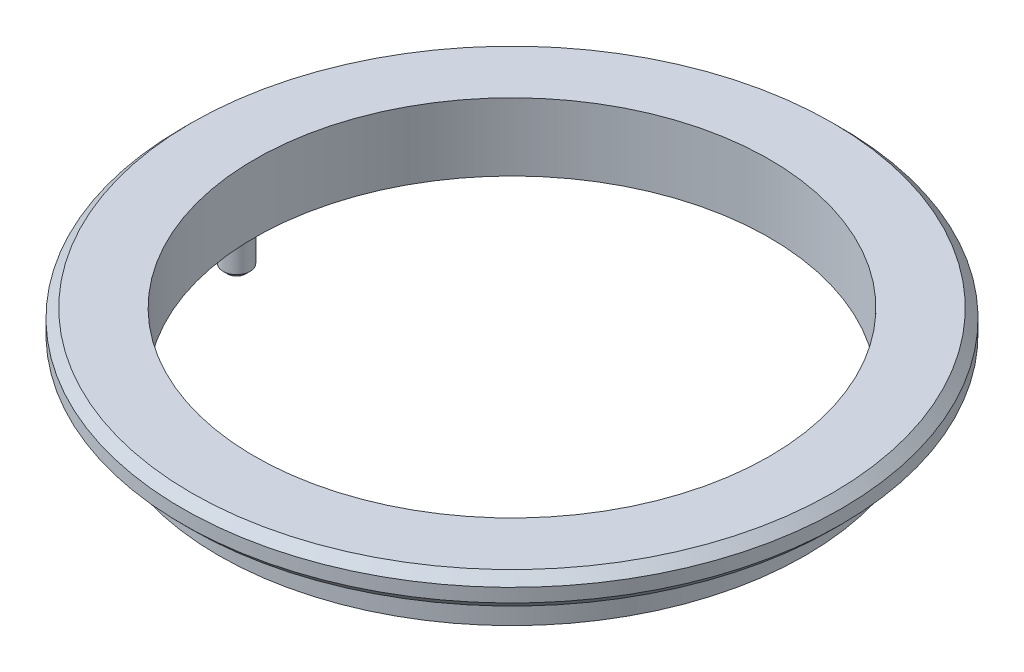
ISO-10303-21;
HEADER;
FILE_DESCRIPTION(('STEP AP214'),'2;1');
FILE_NAME('part.step','',(''),(''),'','','');
FILE_SCHEMA(('AUTOMOTIVE_DESIGN { 1 0 10303 214 1 1 1 1 }'));
ENDSEC;
DATA;
#1=APPLICATION_CONTEXT('core data for automotive mechanical design processes');
#2=APPLICATION_PROTOCOL_DEFINITION('international standard','automotive_design',2000,#1);
#3=PRODUCT_CONTEXT('',#1,'mechanical');
#4=PRODUCT('Part','Part','',(#3));
#5=PRODUCT_RELATED_PRODUCT_CATEGORY('part','',(#4));
#6=PRODUCT_DEFINITION_FORMATION('','',#4);
#7=PRODUCT_DEFINITION_CONTEXT('part definition',#1,'design');
#8=PRODUCT_DEFINITION('design','',#6,#7);
#9=PRODUCT_DEFINITION_SHAPE('','',#8);
#10=(LENGTH_UNIT() NAMED_UNIT(*) SI_UNIT(.MILLI.,.METRE.));
#11=(NAMED_UNIT(*) PLANE_ANGLE_UNIT() SI_UNIT($,.RADIAN.));
#12=(NAMED_UNIT(*) SI_UNIT($,.STERADIAN.) SOLID_ANGLE_UNIT());
#13=UNCERTAINTY_MEASURE_WITH_UNIT(LENGTH_MEASURE(1.E-05),#10,'distance_accuracy_value','');
#14=(GEOMETRIC_REPRESENTATION_CONTEXT(3) GLOBAL_UNCERTAINTY_ASSIGNED_CONTEXT((#13)) GLOBAL_UNIT_ASSIGNED_CONTEXT((#10,
#11,#12)) REPRESENTATION_CONTEXT('',''));
#15=CARTESIAN_POINT('',(0.,0.,0.));
#16=DIRECTION('',(0.,0.,1.));
#17=DIRECTION('',(1.,0.,0.));
#18=AXIS2_PLACEMENT_3D('',#15,#16,#17);
#19=CARTESIAN_POINT('',(-190.121307373047,-33.,-182.5));
#20=DIRECTION('',(0.,1.,0.));
#21=DIRECTION('',(-1.,0.,0.));
#22=AXIS2_PLACEMENT_3D('',#19,#20,#21);
#23=CYLINDRICAL_SURFACE('',#22,32.5);
#24=CARTESIAN_POINT('',(-190.121307373047,-29.,-182.5));
#25=DIRECTION('',(0.,-1.,0.));
#26=DIRECTION('',(-1.,0.,0.));
#27=AXIS2_PLACEMENT_3D('',#24,#25,#26);
#28=CIRCLE('',#27,32.5);
#29=CARTESIAN_POINT('',(-157.621307373047,-29.,-182.5));
#30=VERTEX_POINT('',#29);
#31=EDGE_CURVE('E149',#30,#30,#28,.T.);
#32=ORIENTED_EDGE('',*,*,#31,.T.);
#33=DIRECTION('',(0.,-1.,0.));
#34=VECTOR('',#33,1.);
#35=CARTESIAN_POINT('',(-157.621307373047,-33.,-182.5));
#36=LINE('',#35,#34);
#37=CARTESIAN_POINT('',(-157.621307373047,-32.9999,-182.5));
#38=VERTEX_POINT('',#37);
#39=EDGE_CURVE('E11',#30,#38,#36,.T.);
#40=ORIENTED_EDGE('',*,*,#39,.T.);
#41=CARTESIAN_POINT('',(-190.121307373047,-32.9999,-182.5));
#42=DIRECTION('',(0.,1.,0.));
#43=DIRECTION('',(-1.,0.,0.));
#44=AXIS2_PLACEMENT_3D('',#41,#42,#43);
#45=CIRCLE('',#44,32.5);
#46=EDGE_CURVE('E139',#38,#38,#45,.T.);
#47=ORIENTED_EDGE('',*,*,#46,.T.);
#48=ORIENTED_EDGE('',*,*,#39,.F.);
#49=EDGE_LOOP('',(#32,#40,#47,#48));
#50=FACE_BOUND('',#49,.T.);
#51=ADVANCED_FACE('F49',(#50),#23,.T.);
#52=CARTESIAN_POINT('',(-190.121307373047,-33.,-182.5));
#53=DIRECTION('',(0.,1.,0.));
#54=DIRECTION('',(-1.,0.,0.));
#55=AXIS2_PLACEMENT_3D('',#52,#53,#54);
#56=CYLINDRICAL_SURFACE('',#55,28.5);
#57=CARTESIAN_POINT('',(-190.121307373047,-25.5,-182.5));
#58=DIRECTION('',(0.,1.,0.));
#59=DIRECTION('',(-1.,0.,0.));
#60=AXIS2_PLACEMENT_3D('',#57,#58,#59);
#61=CIRCLE('',#60,28.5);
#62=CARTESIAN_POINT('',(-161.621307373047,-25.5,-182.5));
#63=VERTEX_POINT('',#62);
#64=EDGE_CURVE('E133',#63,#63,#61,.T.);
#65=ORIENTED_EDGE('',*,*,#64,.T.);
#66=DIRECTION('',(0.,-1.,0.));
#67=VECTOR('',#66,1.);
#68=CARTESIAN_POINT('',(-161.621307373047,-33.,-182.5));
#69=LINE('',#68,#67);
#70=CARTESIAN_POINT('',(-161.621307373047,-32.9999,-182.5));
#71=VERTEX_POINT('',#70);
#72=EDGE_CURVE('E57',#63,#71,#69,.T.);
#73=ORIENTED_EDGE('',*,*,#72,.T.);
#74=CARTESIAN_POINT('',(-190.121307373047,-32.9999,-182.5));
#75=DIRECTION('',(0.,-1.,0.));
#76=DIRECTION('',(-1.,0.,0.));
#77=AXIS2_PLACEMENT_3D('',#74,#75,#76);
#78=CIRCLE('',#77,28.5);
#79=EDGE_CURVE('E135',#71,#71,#78,.T.);
#80=ORIENTED_EDGE('',*,*,#79,.T.);
#81=ORIENTED_EDGE('',*,*,#72,.F.);
#82=EDGE_LOOP('',(#65,#73,#80,#81));
#83=FACE_BOUND('',#82,.T.);
#84=ADVANCED_FACE('F171',(#83),#56,.F.);
#85=CARTESIAN_POINT('',(-190.121307373047,-29.,-182.5));
#86=DIRECTION('',(0.,1.,0.));
#87=DIRECTION('',(0.,0.,-1.));
#88=AXIS2_PLACEMENT_3D('',#85,#86,#87);
#89=PLANE('',#88);
#90=ORIENTED_EDGE('',*,*,#31,.F.);
#91=EDGE_LOOP('',(#90));
#92=FACE_BOUND('',#91,.T.);
#93=CARTESIAN_POINT('',(-190.121307373047,-29.,-182.5));
#94=DIRECTION('',(0.,1.,0.));
#95=DIRECTION('',(-1.,0.,0.));
#96=AXIS2_PLACEMENT_3D('',#93,#94,#95);
#97=CIRCLE('',#96,35.5);
#98=CARTESIAN_POINT('',(-154.621307373047,-29.,-182.5));
#99=VERTEX_POINT('',#98);
#100=EDGE_CURVE('E150',#99,#99,#97,.T.);
#101=ORIENTED_EDGE('',*,*,#100,.F.);
#102=EDGE_LOOP('',(#101));
#103=FACE_BOUND('',#102,.T.);
#104=ADVANCED_FACE('F195',(#92,#103),#89,.F.);
#105=CARTESIAN_POINT('',(-190.121307373047,-28.5,-182.5));
#106=DIRECTION('',(0.,1.,0.));
#107=DIRECTION('',(-1.,0.,0.));
#108=AXIS2_PLACEMENT_3D('',#105,#106,#107);
#109=CONICAL_SURFACE('',#108,36.,0.785398163397455);
#110=ORIENTED_EDGE('',*,*,#100,.T.);
#111=DIRECTION('',(0.707106781186552,0.707106781186543,0.));
#112=VECTOR('',#111,1.);
#113=CARTESIAN_POINT('',(-154.121307373047,-28.5,-182.5));
#114=LINE('',#113,#112);
#115=CARTESIAN_POINT('',(-153.621307373047,-28.,-182.5));
#116=VERTEX_POINT('',#115);
#117=EDGE_CURVE('E77',#99,#116,#114,.T.);
#118=ORIENTED_EDGE('',*,*,#117,.T.);
#119=CARTESIAN_POINT('',(-190.121307373047,-28.,-182.5));
#120=DIRECTION('',(0.,-1.,0.));
#121=DIRECTION('',(-1.,0.,0.));
#122=AXIS2_PLACEMENT_3D('',#119,#120,#121);
#123=CIRCLE('',#122,36.5);
#124=EDGE_CURVE('E134',#116,#116,#123,.T.);
#125=ORIENTED_EDGE('',*,*,#124,.T.);
#126=ORIENTED_EDGE('',*,*,#117,.F.);
#127=EDGE_LOOP('',(#110,#118,#125,#126));
#128=FACE_BOUND('',#127,.T.);
#129=ADVANCED_FACE('F179',(#128),#109,.T.);
#130=CARTESIAN_POINT('',(-190.121307373047,-25.5,-182.5));
#131=DIRECTION('',(0.,1.,0.));
#132=DIRECTION('',(0.,0.,-1.));
#133=AXIS2_PLACEMENT_3D('',#130,#131,#132);
#134=PLANE('',#133);
#135=ORIENTED_EDGE('',*,*,#64,.F.);
#136=EDGE_LOOP('',(#135));
#137=FACE_BOUND('',#136,.T.);
#138=CARTESIAN_POINT('',(-190.121307373047,-25.5,-182.5));
#139=DIRECTION('',(0.,-1.,0.));
#140=DIRECTION('',(-1.,0.,0.));
#141=AXIS2_PLACEMENT_3D('',#138,#139,#140);
#142=CIRCLE('',#141,35.5);
#143=CARTESIAN_POINT('',(-154.621307373047,-25.5,-182.5));
#144=VERTEX_POINT('',#143);
#145=EDGE_CURVE('E161',#144,#144,#142,.T.);
#146=ORIENTED_EDGE('',*,*,#145,.F.);
#147=EDGE_LOOP('',(#146));
#148=FACE_BOUND('',#147,.T.);
#149=ADVANCED_FACE('F175',(#137,#148),#134,.T.);
#150=CARTESIAN_POINT('',(-190.121307373047,-25.,-182.5));
#151=DIRECTION('',(0.,-1.,0.));
#152=DIRECTION('',(-1.,0.,0.));
#153=AXIS2_PLACEMENT_3D('',#150,#151,#152);
#154=CYLINDRICAL_SURFACE('',#153,36.5);
#155=ORIENTED_EDGE('',*,*,#124,.F.);
#156=DIRECTION('',(0.,1.,0.));
#157=VECTOR('',#156,1.);
#158=CARTESIAN_POINT('',(-153.621307373047,-25.,-182.5));
#159=LINE('',#158,#157);
#160=CARTESIAN_POINT('',(-153.621307373047,-26.5,-182.5));
#161=VERTEX_POINT('',#160);
#162=EDGE_CURVE('E131',#116,#161,#159,.T.);
#163=ORIENTED_EDGE('',*,*,#162,.T.);
#164=CARTESIAN_POINT('',(-190.121307373047,-26.5,-182.5));
#165=DIRECTION('',(0.,1.,0.));
#166=DIRECTION('',(-1.,0.,0.));
#167=AXIS2_PLACEMENT_3D('',#164,#165,#166);
#168=CIRCLE('',#167,36.5);
#169=EDGE_CURVE('E138',#161,#161,#168,.T.);
#170=ORIENTED_EDGE('',*,*,#169,.F.);
#171=ORIENTED_EDGE('',*,*,#162,.F.);
#172=EDGE_LOOP('',(#155,#163,#170,#171));
#173=FACE_BOUND('',#172,.T.);
#174=ADVANCED_FACE('F178',(#173),#154,.T.);
#175=CARTESIAN_POINT('',(-190.121307373047,-26.,-182.5));
#176=DIRECTION('',(0.,-1.,0.));
#177=DIRECTION('',(-1.,0.,0.));
#178=AXIS2_PLACEMENT_3D('',#175,#176,#177);
#179=CONICAL_SURFACE('',#178,36.,0.785398163397455);
#180=ORIENTED_EDGE('',*,*,#169,.T.);
#181=DIRECTION('',(-0.707106781186552,0.707106781186543,0.));
#182=VECTOR('',#181,1.);
#183=CARTESIAN_POINT('',(-154.121307373047,-26.,-182.5));
#184=LINE('',#183,#182);
#185=EDGE_CURVE('E158',#161,#144,#184,.T.);
#186=ORIENTED_EDGE('',*,*,#185,.T.);
#187=ORIENTED_EDGE('',*,*,#145,.T.);
#188=ORIENTED_EDGE('',*,*,#185,.F.);
#189=EDGE_LOOP('',(#180,#186,#187,#188));
#190=FACE_BOUND('',#189,.T.);
#191=ADVANCED_FACE('F185',(#190),#179,.T.);
#192=CARTESIAN_POINT('',(-190.121307373047,-32.9999,-182.5));
#193=DIRECTION('',(0.,1.,0.));
#194=DIRECTION('',(0.,0.,-1.));
#195=AXIS2_PLACEMENT_3D('',#192,#193,#194);
#196=PLANE('',#195);
#197=ORIENTED_EDGE('',*,*,#79,.F.);
#198=EDGE_LOOP('',(#197));
#199=FACE_BOUND('',#198,.T.);
#200=CARTESIAN_POINT('',(-220.621307373047,-32.9999,-182.5));
#201=DIRECTION('',(0.,1.,0.));
#202=DIRECTION('',(1.,0.,0.));
#203=AXIS2_PLACEMENT_3D('',#200,#201,#202);
#204=CIRCLE('',#203,1.5);
#205=CARTESIAN_POINT('',(-222.121307373047,-32.9999,-182.5));
#206=VERTEX_POINT('',#205);
#207=EDGE_CURVE('E144',#206,#206,#204,.T.);
#208=ORIENTED_EDGE('',*,*,#207,.T.);
#209=EDGE_LOOP('',(#208));
#210=FACE_BOUND('',#209,.T.);
#211=ORIENTED_EDGE('',*,*,#46,.F.);
#212=EDGE_LOOP('',(#211));
#213=FACE_BOUND('',#212,.T.);
#214=ADVANCED_FACE('F213',(#199,#210,#213),#196,.F.);
#215=CARTESIAN_POINT('',(-220.621307373047,-36.9999,-182.5));
#216=DIRECTION('',(0.,-1.,0.));
#217=DIRECTION('',(-1.,0.,0.));
#218=AXIS2_PLACEMENT_3D('',#215,#216,#217);
#219=PLANE('',#218);
#220=CARTESIAN_POINT('',(-220.621307373047,-36.9999,-182.5));
#221=DIRECTION('',(0.,1.,0.));
#222=DIRECTION('',(1.,0.,0.));
#223=AXIS2_PLACEMENT_3D('',#220,#221,#222);
#224=CIRCLE('',#223,1.);
#225=CARTESIAN_POINT('',(-221.621307373047,-36.9999,-182.5));
#226=VERTEX_POINT('',#225);
#227=EDGE_CURVE('E117',#226,#226,#224,.T.);
#228=ORIENTED_EDGE('',*,*,#227,.F.);
#229=EDGE_LOOP('',(#228));
#230=FACE_BOUND('',#229,.T.);
#231=ADVANCED_FACE('F215',(#230),#219,.T.);
#232=CARTESIAN_POINT('',(-220.621307373047,-32.9999,-182.5));
#233=DIRECTION('',(0.,-1.,0.));
#234=DIRECTION('',(1.,0.,0.));
#235=AXIS2_PLACEMENT_3D('',#232,#233,#234);
#236=CYLINDRICAL_SURFACE('',#235,1.5);
#237=CARTESIAN_POINT('',(-220.621307373047,-36.4999,-182.5));
#238=DIRECTION('',(0.,-1.,0.));
#239=DIRECTION('',(1.,0.,0.));
#240=AXIS2_PLACEMENT_3D('',#237,#238,#239);
#241=CIRCLE('',#240,1.5);
#242=CARTESIAN_POINT('',(-222.121307373047,-36.4999,-182.5));
#243=VERTEX_POINT('',#242);
#244=EDGE_CURVE('E119',#243,#243,#241,.T.);
#245=ORIENTED_EDGE('',*,*,#244,.F.);
#246=DIRECTION('',(0.,1.,0.));
#247=VECTOR('',#246,1.);
#248=CARTESIAN_POINT('',(-222.121307373047,-32.9999,-182.5));
#249=LINE('',#248,#247);
#250=EDGE_CURVE('E126',#243,#206,#249,.T.);
#251=ORIENTED_EDGE('',*,*,#250,.T.);
#252=ORIENTED_EDGE('',*,*,#207,.F.);
#253=ORIENTED_EDGE('',*,*,#250,.F.);
#254=EDGE_LOOP('',(#245,#251,#252,#253));
#255=FACE_BOUND('',#254,.T.);
#256=ADVANCED_FACE('F223',(#255),#236,.T.);
#257=CARTESIAN_POINT('',(-220.621307373047,-36.7499,-182.5));
#258=DIRECTION('',(0.,1.,0.));
#259=DIRECTION('',(1.,0.,0.));
#260=AXIS2_PLACEMENT_3D('',#257,#258,#259);
#261=CONICAL_SURFACE('',#260,1.25000000000002,0.785398163397457);
#262=ORIENTED_EDGE('',*,*,#227,.T.);
#263=DIRECTION('',(-0.707106781186554,0.707106781186541,0.));
#264=VECTOR('',#263,1.);
#265=CARTESIAN_POINT('',(-221.871307373047,-36.7499,-182.5));
#266=LINE('',#265,#264);
#267=EDGE_CURVE('E114',#226,#243,#266,.T.);
#268=ORIENTED_EDGE('',*,*,#267,.T.);
#269=ORIENTED_EDGE('',*,*,#244,.T.);
#270=ORIENTED_EDGE('',*,*,#267,.F.);
#271=EDGE_LOOP('',(#262,#268,#269,#270));
#272=FACE_BOUND('',#271,.T.);
#273=ADVANCED_FACE('F115',(#272),#261,.T.);
#274=CLOSED_SHELL('',(#51,#84,#104,#129,#149,#174,#191,#214,#231,#256,#273));
#275=MANIFOLD_SOLID_BREP('B2',#274);
#276=ADVANCED_BREP_SHAPE_REPRESENTATION('',(#18,#275),#14);
#277=SHAPE_DEFINITION_REPRESENTATION(#9,#276);
ENDSEC;
END-ISO-10303-21;
